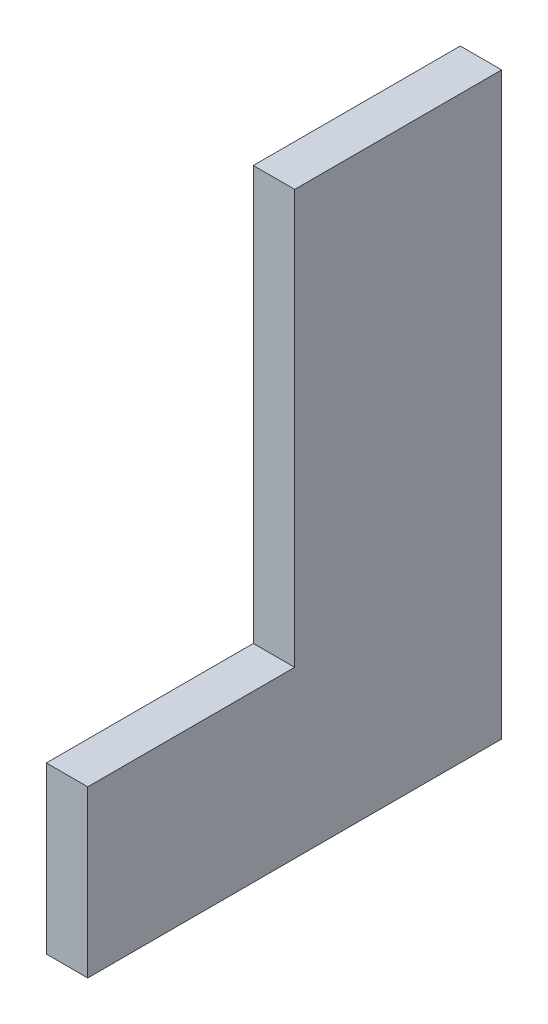
ISO-10303-21;
HEADER;
FILE_DESCRIPTION(('STEP AP214'),'2;1');
FILE_NAME('part.step','',(''),(''),'','','');
FILE_SCHEMA(('AUTOMOTIVE_DESIGN { 1 0 10303 214 1 1 1 1 }'));
ENDSEC;
DATA;
#1=APPLICATION_CONTEXT('core data for automotive mechanical design processes');
#2=APPLICATION_PROTOCOL_DEFINITION('international standard','automotive_design',2000,#1);
#3=PRODUCT_CONTEXT('',#1,'mechanical');
#4=PRODUCT('Part','Part','',(#3));
#5=PRODUCT_RELATED_PRODUCT_CATEGORY('part','',(#4));
#6=PRODUCT_DEFINITION_FORMATION('','',#4);
#7=PRODUCT_DEFINITION_CONTEXT('part definition',#1,'design');
#8=PRODUCT_DEFINITION('design','',#6,#7);
#9=PRODUCT_DEFINITION_SHAPE('','',#8);
#10=(LENGTH_UNIT() NAMED_UNIT(*) SI_UNIT(.MILLI.,.METRE.));
#11=(NAMED_UNIT(*) PLANE_ANGLE_UNIT() SI_UNIT($,.RADIAN.));
#12=(NAMED_UNIT(*) SI_UNIT($,.STERADIAN.) SOLID_ANGLE_UNIT());
#13=UNCERTAINTY_MEASURE_WITH_UNIT(LENGTH_MEASURE(1.E-05),#10,'distance_accuracy_value','');
#14=(GEOMETRIC_REPRESENTATION_CONTEXT(3) GLOBAL_UNCERTAINTY_ASSIGNED_CONTEXT((#13)) GLOBAL_UNIT_ASSIGNED_CONTEXT((#10,
#11,#12)) REPRESENTATION_CONTEXT('',''));
#15=CARTESIAN_POINT('',(0.,0.,0.));
#16=DIRECTION('',(0.,0.,1.));
#17=DIRECTION('',(1.,0.,0.));
#18=AXIS2_PLACEMENT_3D('',#15,#16,#17);
#19=CARTESIAN_POINT('',(0.,0.,100.));
#20=DIRECTION('',(0.,0.,-1.));
#21=DIRECTION('',(-1.,0.,0.));
#22=AXIS2_PLACEMENT_3D('',#19,#20,#21);
#23=PLANE('',#22);
#24=DIRECTION('',(-1.,0.,0.));
#25=VECTOR('',#24,1.);
#26=CARTESIAN_POINT('',(138.062484748657,-60.0000000000009,100.));
#27=LINE('',#26,#25);
#28=CARTESIAN_POINT('',(9.99999999999998,-60.0000000000009,100.));
#29=VERTEX_POINT('',#28);
#30=CARTESIAN_POINT('',(-10.,-60.0000000000009,100.));
#31=VERTEX_POINT('',#30);
#32=EDGE_CURVE('E58',#29,#31,#27,.T.);
#33=ORIENTED_EDGE('',*,*,#32,.F.);
#34=DIRECTION('',(0.,1.,0.));
#35=VECTOR('',#34,1.);
#36=CARTESIAN_POINT('',(9.99999999999998,-140.,100.));
#37=LINE('',#36,#35);
#38=CARTESIAN_POINT('',(9.99999999999998,140.,100.));
#39=VERTEX_POINT('',#38);
#40=EDGE_CURVE('E95',#29,#39,#37,.T.);
#41=ORIENTED_EDGE('',*,*,#40,.T.);
#42=DIRECTION('',(-1.,0.,0.));
#43=VECTOR('',#42,1.);
#44=CARTESIAN_POINT('',(-10.,140.,100.));
#45=LINE('',#44,#43);
#46=CARTESIAN_POINT('',(-10.,140.,100.));
#47=VERTEX_POINT('',#46);
#48=EDGE_CURVE('E64',#39,#47,#45,.T.);
#49=ORIENTED_EDGE('',*,*,#48,.T.);
#50=DIRECTION('',(0.,-1.,0.));
#51=VECTOR('',#50,1.);
#52=CARTESIAN_POINT('',(-10.,-140.,100.));
#53=LINE('',#52,#51);
#54=EDGE_CURVE('E106',#47,#31,#53,.T.);
#55=ORIENTED_EDGE('',*,*,#54,.T.);
#56=EDGE_LOOP('',(#33,#41,#49,#55));
#57=FACE_BOUND('',#56,.T.);
#58=ADVANCED_FACE('F43',(#57),#23,.F.);
#59=CARTESIAN_POINT('',(9.99999999999998,-140.,100.));
#60=DIRECTION('',(-1.,0.,0.));
#61=DIRECTION('',(0.,0.,1.));
#62=AXIS2_PLACEMENT_3D('',#59,#60,#61);
#63=PLANE('',#62);
#64=DIRECTION('',(0.,1.,0.));
#65=VECTOR('',#64,1.);
#66=CARTESIAN_POINT('',(9.99999999999998,-140.,0.));
#67=LINE('',#66,#65);
#68=CARTESIAN_POINT('',(9.99999999999998,-140.,0.));
#69=VERTEX_POINT('',#68);
#70=CARTESIAN_POINT('',(9.99999999999998,140.,0.));
#71=VERTEX_POINT('',#70);
#72=EDGE_CURVE('E101',#69,#71,#67,.T.);
#73=ORIENTED_EDGE('',*,*,#72,.T.);
#74=DIRECTION('',(0.,0.,-1.));
#75=VECTOR('',#74,1.);
#76=CARTESIAN_POINT('',(9.99999999999998,140.,100.));
#77=LINE('',#76,#75);
#78=EDGE_CURVE('E11',#39,#71,#77,.T.);
#79=ORIENTED_EDGE('',*,*,#78,.F.);
#80=ORIENTED_EDGE('',*,*,#40,.F.);
#81=DIRECTION('',(0.,0.,1.));
#82=VECTOR('',#81,1.);
#83=CARTESIAN_POINT('',(9.99999999999998,-60.0000000000009,200.));
#84=LINE('',#83,#82);
#85=CARTESIAN_POINT('',(9.99999999999998,-60.0000000000009,200.));
#86=VERTEX_POINT('',#85);
#87=EDGE_CURVE('E110',#29,#86,#84,.T.);
#88=ORIENTED_EDGE('',*,*,#87,.T.);
#89=DIRECTION('',(0.,-1.,0.));
#90=VECTOR('',#89,1.);
#91=CARTESIAN_POINT('',(9.99999999999998,-60.0000000000009,200.));
#92=LINE('',#91,#90);
#93=CARTESIAN_POINT('',(9.99999999999998,-140.,200.));
#94=VERTEX_POINT('',#93);
#95=EDGE_CURVE('E104',#86,#94,#92,.T.);
#96=ORIENTED_EDGE('',*,*,#95,.T.);
#97=DIRECTION('',(0.,0.,-1.));
#98=VECTOR('',#97,1.);
#99=CARTESIAN_POINT('',(9.99999999999998,-140.,100.));
#100=LINE('',#99,#98);
#101=EDGE_CURVE('E88',#94,#69,#100,.T.);
#102=ORIENTED_EDGE('',*,*,#101,.T.);
#103=EDGE_LOOP('',(#73,#79,#80,#88,#96,#102));
#104=FACE_BOUND('',#103,.T.);
#105=ADVANCED_FACE('F45',(#104),#63,.F.);
#106=CARTESIAN_POINT('',(-10.,140.,100.));
#107=DIRECTION('',(0.,-1.,0.));
#108=DIRECTION('',(0.,0.,-1.));
#109=AXIS2_PLACEMENT_3D('',#106,#107,#108);
#110=PLANE('',#109);
#111=DIRECTION('',(-1.,0.,0.));
#112=VECTOR('',#111,1.);
#113=CARTESIAN_POINT('',(-10.,140.,0.));
#114=LINE('',#113,#112);
#115=CARTESIAN_POINT('',(-10.,140.,0.));
#116=VERTEX_POINT('',#115);
#117=EDGE_CURVE('E109',#71,#116,#114,.T.);
#118=ORIENTED_EDGE('',*,*,#117,.T.);
#119=DIRECTION('',(0.,0.,-1.));
#120=VECTOR('',#119,1.);
#121=CARTESIAN_POINT('',(-10.,140.,100.));
#122=LINE('',#121,#120);
#123=EDGE_CURVE('E51',#47,#116,#122,.T.);
#124=ORIENTED_EDGE('',*,*,#123,.F.);
#125=ORIENTED_EDGE('',*,*,#48,.F.);
#126=ORIENTED_EDGE('',*,*,#78,.T.);
#127=EDGE_LOOP('',(#118,#124,#125,#126));
#128=FACE_BOUND('',#127,.T.);
#129=ADVANCED_FACE('F124',(#128),#110,.F.);
#130=CARTESIAN_POINT('',(-10.,-140.,100.));
#131=DIRECTION('',(1.,0.,0.));
#132=DIRECTION('',(0.,0.,-1.));
#133=AXIS2_PLACEMENT_3D('',#130,#131,#132);
#134=PLANE('',#133);
#135=DIRECTION('',(0.,-1.,0.));
#136=VECTOR('',#135,1.);
#137=CARTESIAN_POINT('',(-10.,-140.,0.));
#138=LINE('',#137,#136);
#139=CARTESIAN_POINT('',(-10.,-140.,0.));
#140=VERTEX_POINT('',#139);
#141=EDGE_CURVE('E96',#116,#140,#138,.T.);
#142=ORIENTED_EDGE('',*,*,#141,.T.);
#143=DIRECTION('',(0.,0.,-1.));
#144=VECTOR('',#143,1.);
#145=CARTESIAN_POINT('',(-10.,-140.,100.));
#146=LINE('',#145,#144);
#147=CARTESIAN_POINT('',(-10.,-140.,200.));
#148=VERTEX_POINT('',#147);
#149=EDGE_CURVE('E91',#148,#140,#146,.T.);
#150=ORIENTED_EDGE('',*,*,#149,.F.);
#151=DIRECTION('',(0.,1.,0.));
#152=VECTOR('',#151,1.);
#153=CARTESIAN_POINT('',(-10.,-60.0000000000009,200.));
#154=LINE('',#153,#152);
#155=CARTESIAN_POINT('',(-10.,-60.0000000000009,200.));
#156=VERTEX_POINT('',#155);
#157=EDGE_CURVE('E145',#148,#156,#154,.T.);
#158=ORIENTED_EDGE('',*,*,#157,.T.);
#159=DIRECTION('',(0.,0.,-1.));
#160=VECTOR('',#159,1.);
#161=CARTESIAN_POINT('',(-10.,-60.0000000000009,200.));
#162=LINE('',#161,#160);
#163=EDGE_CURVE('E136',#156,#31,#162,.T.);
#164=ORIENTED_EDGE('',*,*,#163,.T.);
#165=ORIENTED_EDGE('',*,*,#54,.F.);
#166=ORIENTED_EDGE('',*,*,#123,.T.);
#167=EDGE_LOOP('',(#142,#150,#158,#164,#165,#166));
#168=FACE_BOUND('',#167,.T.);
#169=ADVANCED_FACE('F121',(#168),#134,.F.);
#170=CARTESIAN_POINT('',(-10.,-140.,100.));
#171=DIRECTION('',(0.,1.,0.));
#172=DIRECTION('',(0.,0.,1.));
#173=AXIS2_PLACEMENT_3D('',#170,#171,#172);
#174=PLANE('',#173);
#175=DIRECTION('',(1.,0.,0.));
#176=VECTOR('',#175,1.);
#177=CARTESIAN_POINT('',(-10.,-140.,0.));
#178=LINE('',#177,#176);
#179=EDGE_CURVE('E84',#140,#69,#178,.T.);
#180=ORIENTED_EDGE('',*,*,#179,.T.);
#181=ORIENTED_EDGE('',*,*,#101,.F.);
#182=DIRECTION('',(-1.,0.,0.));
#183=VECTOR('',#182,1.);
#184=CARTESIAN_POINT('',(138.062484748657,-140.,200.));
#185=LINE('',#184,#183);
#186=EDGE_CURVE('E143',#94,#148,#185,.T.);
#187=ORIENTED_EDGE('',*,*,#186,.T.);
#188=ORIENTED_EDGE('',*,*,#149,.T.);
#189=EDGE_LOOP('',(#180,#181,#187,#188));
#190=FACE_BOUND('',#189,.T.);
#191=ADVANCED_FACE('F86',(#190),#174,.F.);
#192=CARTESIAN_POINT('',(0.,0.,0.));
#193=DIRECTION('',(0.,0.,-1.));
#194=DIRECTION('',(-1.,0.,0.));
#195=AXIS2_PLACEMENT_3D('',#192,#193,#194);
#196=PLANE('',#195);
#197=ORIENTED_EDGE('',*,*,#72,.F.);
#198=ORIENTED_EDGE('',*,*,#179,.F.);
#199=ORIENTED_EDGE('',*,*,#141,.F.);
#200=ORIENTED_EDGE('',*,*,#117,.F.);
#201=EDGE_LOOP('',(#197,#198,#199,#200));
#202=FACE_BOUND('',#201,.T.);
#203=ADVANCED_FACE('F108',(#202),#196,.T.);
#204=CARTESIAN_POINT('',(138.062484748657,-60.0000000000009,200.));
#205=DIRECTION('',(0.,0.,1.));
#206=DIRECTION('',(1.,0.,0.));
#207=AXIS2_PLACEMENT_3D('',#204,#205,#206);
#208=PLANE('',#207);
#209=ORIENTED_EDGE('',*,*,#95,.F.);
#210=DIRECTION('',(-1.,0.,0.));
#211=VECTOR('',#210,1.);
#212=CARTESIAN_POINT('',(138.062484748657,-60.0000000000009,200.));
#213=LINE('',#212,#211);
#214=EDGE_CURVE('E134',#86,#156,#213,.T.);
#215=ORIENTED_EDGE('',*,*,#214,.T.);
#216=ORIENTED_EDGE('',*,*,#157,.F.);
#217=ORIENTED_EDGE('',*,*,#186,.F.);
#218=EDGE_LOOP('',(#209,#215,#216,#217));
#219=FACE_BOUND('',#218,.T.);
#220=ADVANCED_FACE('F151',(#219),#208,.T.);
#221=CARTESIAN_POINT('',(138.062484748657,-60.0000000000009,200.));
#222=DIRECTION('',(0.,1.,0.));
#223=DIRECTION('',(0.,0.,1.));
#224=AXIS2_PLACEMENT_3D('',#221,#222,#223);
#225=PLANE('',#224);
#226=ORIENTED_EDGE('',*,*,#87,.F.);
#227=ORIENTED_EDGE('',*,*,#32,.T.);
#228=ORIENTED_EDGE('',*,*,#163,.F.);
#229=ORIENTED_EDGE('',*,*,#214,.F.);
#230=EDGE_LOOP('',(#226,#227,#228,#229));
#231=FACE_BOUND('',#230,.T.);
#232=ADVANCED_FACE('F130',(#231),#225,.T.);
#233=CLOSED_SHELL('',(#58,#105,#129,#169,#191,#203,#220,#232));
#234=MANIFOLD_SOLID_BREP('B2',#233);
#235=ADVANCED_BREP_SHAPE_REPRESENTATION('',(#18,#234),#14);
#236=SHAPE_DEFINITION_REPRESENTATION(#9,#235);
ENDSEC;
END-ISO-10303-21;
